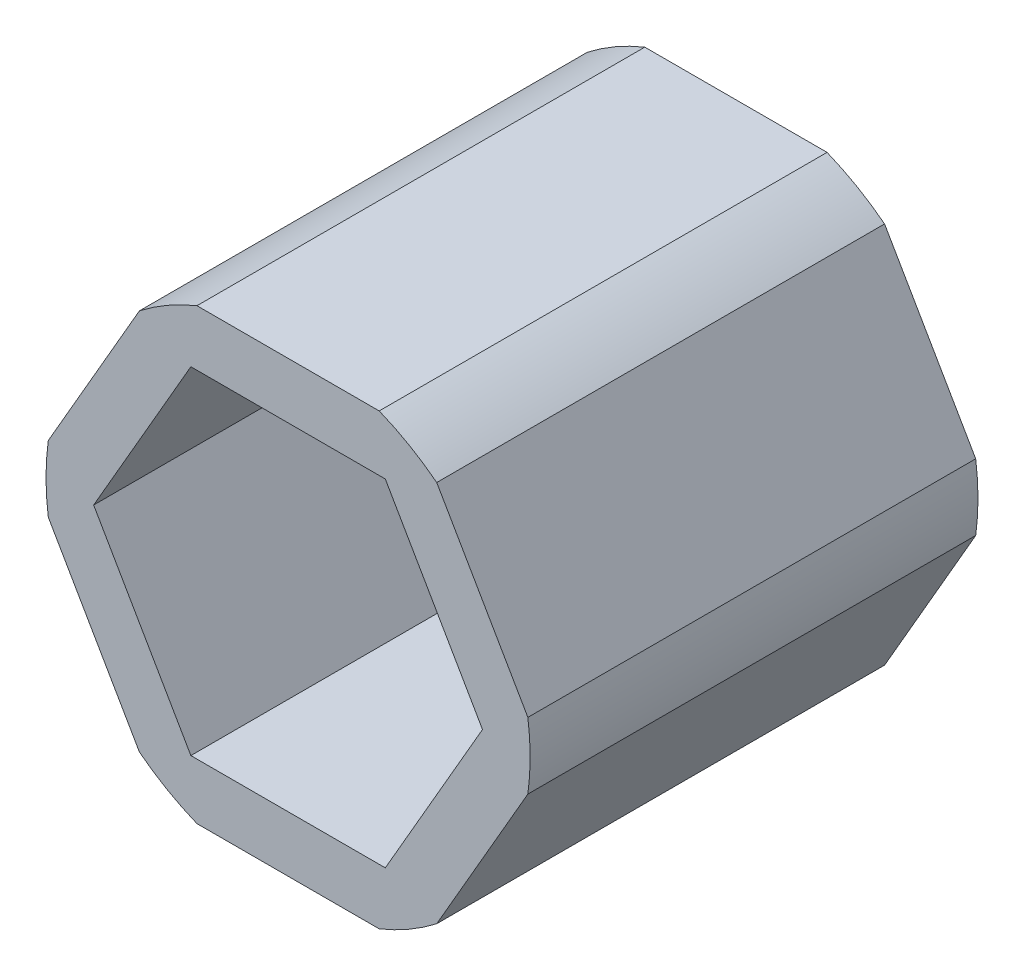
ISO-10303-21;
HEADER;
FILE_DESCRIPTION(('STEP AP214'),'2;1');
FILE_NAME('part.step','',(''),(''),'','','');
FILE_SCHEMA(('AUTOMOTIVE_DESIGN { 1 0 10303 214 1 1 1 1 }'));
ENDSEC;
DATA;
#1=APPLICATION_CONTEXT('core data for automotive mechanical design processes');
#2=APPLICATION_PROTOCOL_DEFINITION('international standard','automotive_design',2000,#1);
#3=PRODUCT_CONTEXT('',#1,'mechanical');
#4=PRODUCT('Part','Part','',(#3));
#5=PRODUCT_RELATED_PRODUCT_CATEGORY('part','',(#4));
#6=PRODUCT_DEFINITION_FORMATION('','',#4);
#7=PRODUCT_DEFINITION_CONTEXT('part definition',#1,'design');
#8=PRODUCT_DEFINITION('design','',#6,#7);
#9=PRODUCT_DEFINITION_SHAPE('','',#8);
#10=(LENGTH_UNIT() NAMED_UNIT(*) SI_UNIT(.MILLI.,.METRE.));
#11=(NAMED_UNIT(*) PLANE_ANGLE_UNIT() SI_UNIT($,.RADIAN.));
#12=(NAMED_UNIT(*) SI_UNIT($,.STERADIAN.) SOLID_ANGLE_UNIT());
#13=UNCERTAINTY_MEASURE_WITH_UNIT(LENGTH_MEASURE(1.E-05),#10,'distance_accuracy_value','');
#14=(GEOMETRIC_REPRESENTATION_CONTEXT(3) GLOBAL_UNCERTAINTY_ASSIGNED_CONTEXT((#13)) GLOBAL_UNIT_ASSIGNED_CONTEXT((#10,
#11,#12)) REPRESENTATION_CONTEXT('',''));
#15=CARTESIAN_POINT('',(0.,0.,0.));
#16=DIRECTION('',(0.,0.,1.));
#17=DIRECTION('',(1.,0.,0.));
#18=AXIS2_PLACEMENT_3D('',#15,#16,#17);
#19=CARTESIAN_POINT('',(0.,0.,-6.35));
#20=DIRECTION('',(0.,0.,1.));
#21=DIRECTION('',(1.,0.,0.));
#22=AXIS2_PLACEMENT_3D('',#19,#20,#21);
#23=CYLINDRICAL_SURFACE('',#22,6.865);
#24=CARTESIAN_POINT('',(0.,0.,6.35));
#25=DIRECTION('',(0.,0.,1.));
#26=DIRECTION('',(1.,0.,0.));
#27=AXIS2_PLACEMENT_3D('',#24,#25,#26);
#28=CIRCLE('',#27,6.865);
#29=CARTESIAN_POINT('',(6.80007335868807,0.941927447556715,6.35));
#30=VERTEX_POINT('',#29);
#31=CARTESIAN_POINT('',(6.80007335868808,-0.941927447556706,6.35));
#32=VERTEX_POINT('',#31);
#33=EDGE_CURVE('E140',#30,#32,#28,.F.);
#34=ORIENTED_EDGE('',*,*,#33,.T.);
#35=DIRECTION('',(0.,0.,1.));
#36=VECTOR('',#35,1.);
#37=CARTESIAN_POINT('',(6.80007335868808,-0.941927447556707,6.35));
#38=LINE('',#37,#36);
#39=CARTESIAN_POINT('',(6.80007335868807,-0.941927447556706,-6.35));
#40=VERTEX_POINT('',#39);
#41=EDGE_CURVE('E215',#32,#40,#38,.F.);
#42=ORIENTED_EDGE('',*,*,#41,.T.);
#43=CARTESIAN_POINT('',(0.,0.,-6.35));
#44=DIRECTION('',(0.,0.,1.));
#45=DIRECTION('',(1.,0.,0.));
#46=AXIS2_PLACEMENT_3D('',#43,#44,#45);
#47=CIRCLE('',#46,6.865);
#48=CARTESIAN_POINT('',(6.80007335868807,0.941927447556718,-6.35));
#49=VERTEX_POINT('',#48);
#50=EDGE_CURVE('E21',#40,#49,#47,.T.);
#51=ORIENTED_EDGE('',*,*,#50,.T.);
#52=DIRECTION('',(0.,0.,1.));
#53=VECTOR('',#52,1.);
#54=CARTESIAN_POINT('',(6.80007335868807,0.941927447556716,6.35));
#55=LINE('',#54,#53);
#56=EDGE_CURVE('E155',#49,#30,#55,.T.);
#57=ORIENTED_EDGE('',*,*,#56,.T.);
#58=EDGE_LOOP('',(#34,#42,#51,#57));
#59=FACE_BOUND('',#58,.T.);
#60=ADVANCED_FACE('F18',(#59),#23,.T.);
#61=CARTESIAN_POINT('',(-2.75684753538046,-4.775,6.35));
#62=DIRECTION('',(0.,1.,0.));
#63=DIRECTION('',(-1.,0.,0.));
#64=AXIS2_PLACEMENT_3D('',#61,#62,#63);
#65=PLANE('',#64);
#66=DIRECTION('',(1.,0.,0.));
#67=VECTOR('',#66,1.);
#68=CARTESIAN_POINT('',(0.,-4.775,6.35));
#69=LINE('',#68,#67);
#70=CARTESIAN_POINT('',(2.75684753538046,-4.775,6.35));
#71=VERTEX_POINT('',#70);
#72=CARTESIAN_POINT('',(-2.75684753538046,-4.775,6.35));
#73=VERTEX_POINT('',#72);
#74=EDGE_CURVE('E175',#71,#73,#69,.F.);
#75=ORIENTED_EDGE('',*,*,#74,.F.);
#76=DIRECTION('',(0.,0.,1.));
#77=VECTOR('',#76,1.);
#78=CARTESIAN_POINT('',(2.75684753538046,-4.775,6.35));
#79=LINE('',#78,#77);
#80=CARTESIAN_POINT('',(2.75684753538046,-4.775,-6.35));
#81=VERTEX_POINT('',#80);
#82=EDGE_CURVE('E181',#81,#71,#79,.T.);
#83=ORIENTED_EDGE('',*,*,#82,.F.);
#84=DIRECTION('',(1.,0.,0.));
#85=VECTOR('',#84,1.);
#86=CARTESIAN_POINT('',(0.,-4.775,-6.35));
#87=LINE('',#86,#85);
#88=CARTESIAN_POINT('',(-2.75684753538046,-4.775,-6.35));
#89=VERTEX_POINT('',#88);
#90=EDGE_CURVE('E208',#81,#89,#87,.F.);
#91=ORIENTED_EDGE('',*,*,#90,.T.);
#92=DIRECTION('',(0.,0.,1.));
#93=VECTOR('',#92,1.);
#94=CARTESIAN_POINT('',(-2.75684753538046,-4.775,6.35));
#95=LINE('',#94,#93);
#96=EDGE_CURVE('E152',#73,#89,#95,.F.);
#97=ORIENTED_EDGE('',*,*,#96,.F.);
#98=EDGE_LOOP('',(#75,#83,#91,#97));
#99=FACE_BOUND('',#98,.T.);
#100=ADVANCED_FACE('F313',(#99),#65,.T.);
#101=CARTESIAN_POINT('',(-5.51369507076093,0.,6.35));
#102=DIRECTION('',(0.866025403784439,0.5,0.));
#103=DIRECTION('',(-0.5,0.866025403784439,0.));
#104=AXIS2_PLACEMENT_3D('',#101,#102,#103);
#105=PLANE('',#104);
#106=DIRECTION('',(-0.5,0.866025403784439,0.));
#107=VECTOR('',#106,1.);
#108=CARTESIAN_POINT('',(-2.75684753538046,-4.775,6.35));
#109=LINE('',#108,#107);
#110=CARTESIAN_POINT('',(-5.51369507076093,0.,6.35));
#111=VERTEX_POINT('',#110);
#112=EDGE_CURVE('E168',#73,#111,#109,.T.);
#113=ORIENTED_EDGE('',*,*,#112,.F.);
#114=ORIENTED_EDGE('',*,*,#96,.T.);
#115=DIRECTION('',(-0.5,0.866025403784439,0.));
#116=VECTOR('',#115,1.);
#117=CARTESIAN_POINT('',(-2.75684753538046,-4.775,-6.35));
#118=LINE('',#117,#116);
#119=CARTESIAN_POINT('',(-5.51369507076093,0.,-6.35));
#120=VERTEX_POINT('',#119);
#121=EDGE_CURVE('E206',#89,#120,#118,.T.);
#122=ORIENTED_EDGE('',*,*,#121,.T.);
#123=DIRECTION('',(0.,0.,1.));
#124=VECTOR('',#123,1.);
#125=CARTESIAN_POINT('',(-5.51369507076093,0.,6.35));
#126=LINE('',#125,#124);
#127=EDGE_CURVE('E210',#111,#120,#126,.F.);
#128=ORIENTED_EDGE('',*,*,#127,.F.);
#129=EDGE_LOOP('',(#113,#114,#122,#128));
#130=FACE_BOUND('',#129,.T.);
#131=ADVANCED_FACE('F317',(#130),#105,.T.);
#132=CARTESIAN_POINT('',(7.34389542409204,0.,6.35));
#133=DIRECTION('',(-0.866025403784438,-0.5,0.));
#134=DIRECTION('',(0.5,-0.866025403784438,0.));
#135=AXIS2_PLACEMENT_3D('',#132,#133,#134);
#136=PLANE('',#135);
#137=DIRECTION('',(-0.5,0.866025403784438,0.));
#138=VECTOR('',#137,1.);
#139=CARTESIAN_POINT('',(6.80007335868807,0.941927447556716,-6.35));
#140=LINE('',#139,#138);
#141=CARTESIAN_POINT('',(4.21576977744998,5.41807255244329,-6.35));
#142=VERTEX_POINT('',#141);
#143=EDGE_CURVE('E187',#49,#142,#140,.T.);
#144=ORIENTED_EDGE('',*,*,#143,.T.);
#145=DIRECTION('',(0.,0.,1.));
#146=VECTOR('',#145,1.);
#147=CARTESIAN_POINT('',(4.21576977744998,5.41807255244329,-6.35));
#148=LINE('',#147,#146);
#149=CARTESIAN_POINT('',(4.21576977744998,5.41807255244329,6.35));
#150=VERTEX_POINT('',#149);
#151=EDGE_CURVE('E158',#150,#142,#148,.F.);
#152=ORIENTED_EDGE('',*,*,#151,.F.);
#153=DIRECTION('',(-0.5,0.866025403784438,0.));
#154=VECTOR('',#153,1.);
#155=CARTESIAN_POINT('',(6.80007335868807,0.941927447556716,6.35));
#156=LINE('',#155,#154);
#157=EDGE_CURVE('E145',#30,#150,#156,.T.);
#158=ORIENTED_EDGE('',*,*,#157,.F.);
#159=ORIENTED_EDGE('',*,*,#56,.F.);
#160=EDGE_LOOP('',(#144,#152,#158,#159));
#161=FACE_BOUND('',#160,.T.);
#162=ADVANCED_FACE('F160',(#161),#136,.F.);
#163=CARTESIAN_POINT('',(0.,0.,-6.35));
#164=DIRECTION('',(0.,0.,1.));
#165=DIRECTION('',(1.,0.,0.));
#166=AXIS2_PLACEMENT_3D('',#163,#164,#165);
#167=CYLINDRICAL_SURFACE('',#166,6.865);
#168=DIRECTION('',(0.,0.,-1.));
#169=VECTOR('',#168,1.);
#170=CARTESIAN_POINT('',(2.58430358123807,6.36000000000001,6.35));
#171=LINE('',#170,#169);
#172=CARTESIAN_POINT('',(2.58430358123807,6.36000000000001,-6.35));
#173=VERTEX_POINT('',#172);
#174=CARTESIAN_POINT('',(2.58430358123807,6.36000000000001,6.35));
#175=VERTEX_POINT('',#174);
#176=EDGE_CURVE('E235',#173,#175,#171,.F.);
#177=ORIENTED_EDGE('',*,*,#176,.T.);
#178=CARTESIAN_POINT('',(0.,0.,6.35));
#179=DIRECTION('',(0.,0.,1.));
#180=DIRECTION('',(1.,0.,0.));
#181=AXIS2_PLACEMENT_3D('',#178,#179,#180);
#182=CIRCLE('',#181,6.865);
#183=EDGE_CURVE('E163',#150,#175,#182,.T.);
#184=ORIENTED_EDGE('',*,*,#183,.F.);
#185=ORIENTED_EDGE('',*,*,#151,.T.);
#186=CARTESIAN_POINT('',(0.,0.,-6.35));
#187=DIRECTION('',(0.,0.,1.));
#188=DIRECTION('',(1.,0.,0.));
#189=AXIS2_PLACEMENT_3D('',#186,#187,#188);
#190=CIRCLE('',#189,6.865);
#191=EDGE_CURVE('E186',#142,#173,#190,.T.);
#192=ORIENTED_EDGE('',*,*,#191,.T.);
#193=EDGE_LOOP('',(#177,#184,#185,#192));
#194=FACE_BOUND('',#193,.T.);
#195=ADVANCED_FACE('F452',(#194),#167,.T.);
#196=CARTESIAN_POINT('',(3.67194771204601,6.36000000000001,6.35));
#197=DIRECTION('',(0.,-1.,0.));
#198=DIRECTION('',(0.,0.,-1.));
#199=AXIS2_PLACEMENT_3D('',#196,#197,#198);
#200=PLANE('',#199);
#201=DIRECTION('',(1.,0.,0.));
#202=VECTOR('',#201,1.);
#203=CARTESIAN_POINT('',(0.,6.36000000000001,-6.35));
#204=LINE('',#203,#202);
#205=CARTESIAN_POINT('',(-2.58430358123807,6.36000000000001,-6.35));
#206=VERTEX_POINT('',#205);
#207=EDGE_CURVE('E202',#173,#206,#204,.F.);
#208=ORIENTED_EDGE('',*,*,#207,.T.);
#209=DIRECTION('',(0.,0.,1.));
#210=VECTOR('',#209,1.);
#211=CARTESIAN_POINT('',(-2.58430358123807,6.36000000000001,-6.35));
#212=LINE('',#211,#210);
#213=CARTESIAN_POINT('',(-2.58430358123807,6.36000000000001,6.35));
#214=VERTEX_POINT('',#213);
#215=EDGE_CURVE('E232',#214,#206,#212,.F.);
#216=ORIENTED_EDGE('',*,*,#215,.F.);
#217=DIRECTION('',(1.,0.,0.));
#218=VECTOR('',#217,1.);
#219=CARTESIAN_POINT('',(0.,6.36000000000001,6.35));
#220=LINE('',#219,#218);
#221=EDGE_CURVE('E166',#175,#214,#220,.F.);
#222=ORIENTED_EDGE('',*,*,#221,.F.);
#223=ORIENTED_EDGE('',*,*,#176,.F.);
#224=EDGE_LOOP('',(#208,#216,#222,#223));
#225=FACE_BOUND('',#224,.T.);
#226=ADVANCED_FACE('F444',(#225),#200,.F.);
#227=CARTESIAN_POINT('',(0.,0.,-6.35));
#228=DIRECTION('',(0.,0.,1.));
#229=DIRECTION('',(1.,0.,0.));
#230=AXIS2_PLACEMENT_3D('',#227,#228,#229);
#231=CYLINDRICAL_SURFACE('',#230,6.865);
#232=DIRECTION('',(0.,0.,1.));
#233=VECTOR('',#232,1.);
#234=CARTESIAN_POINT('',(-4.21576977744999,5.41807255244328,6.35));
#235=LINE('',#234,#233);
#236=CARTESIAN_POINT('',(-4.21576977744999,5.41807255244328,-6.35));
#237=VERTEX_POINT('',#236);
#238=CARTESIAN_POINT('',(-4.21576977744999,5.41807255244328,6.35));
#239=VERTEX_POINT('',#238);
#240=EDGE_CURVE('E230',#237,#239,#235,.T.);
#241=ORIENTED_EDGE('',*,*,#240,.T.);
#242=CARTESIAN_POINT('',(0.,0.,6.35));
#243=DIRECTION('',(0.,0.,1.));
#244=DIRECTION('',(1.,0.,0.));
#245=AXIS2_PLACEMENT_3D('',#242,#243,#244);
#246=CIRCLE('',#245,6.865);
#247=EDGE_CURVE('E251',#214,#239,#246,.T.);
#248=ORIENTED_EDGE('',*,*,#247,.F.);
#249=ORIENTED_EDGE('',*,*,#215,.T.);
#250=CARTESIAN_POINT('',(0.,0.,-6.35));
#251=DIRECTION('',(0.,0.,1.));
#252=DIRECTION('',(1.,0.,0.));
#253=AXIS2_PLACEMENT_3D('',#250,#251,#252);
#254=CIRCLE('',#253,6.865);
#255=EDGE_CURVE('E201',#206,#237,#254,.T.);
#256=ORIENTED_EDGE('',*,*,#255,.T.);
#257=EDGE_LOOP('',(#241,#248,#249,#256));
#258=FACE_BOUND('',#257,.T.);
#259=ADVANCED_FACE('F262',(#258),#231,.T.);
#260=CARTESIAN_POINT('',(-3.67194771204602,6.36000000000001,6.35));
#261=DIRECTION('',(0.866025403784439,-0.5,0.));
#262=DIRECTION('',(0.5,0.866025403784439,0.));
#263=AXIS2_PLACEMENT_3D('',#260,#261,#262);
#264=PLANE('',#263);
#265=DIRECTION('',(-0.5,-0.866025403784439,0.));
#266=VECTOR('',#265,1.);
#267=CARTESIAN_POINT('',(-4.21576977744999,5.41807255244328,-6.35));
#268=LINE('',#267,#266);
#269=CARTESIAN_POINT('',(-6.80007335868807,0.941927447556718,-6.35));
#270=VERTEX_POINT('',#269);
#271=EDGE_CURVE('E199',#237,#270,#268,.T.);
#272=ORIENTED_EDGE('',*,*,#271,.T.);
#273=DIRECTION('',(0.,0.,1.));
#274=VECTOR('',#273,1.);
#275=CARTESIAN_POINT('',(-6.80007335868807,0.941927447556718,-6.35));
#276=LINE('',#275,#274);
#277=CARTESIAN_POINT('',(-6.80007335868807,0.941927447556718,6.35));
#278=VERTEX_POINT('',#277);
#279=EDGE_CURVE('E227',#278,#270,#276,.F.);
#280=ORIENTED_EDGE('',*,*,#279,.F.);
#281=DIRECTION('',(-0.5,-0.866025403784439,0.));
#282=VECTOR('',#281,1.);
#283=CARTESIAN_POINT('',(-4.21576977744999,5.41807255244328,6.35));
#284=LINE('',#283,#282);
#285=EDGE_CURVE('E250',#239,#278,#284,.T.);
#286=ORIENTED_EDGE('',*,*,#285,.F.);
#287=ORIENTED_EDGE('',*,*,#240,.F.);
#288=EDGE_LOOP('',(#272,#280,#286,#287));
#289=FACE_BOUND('',#288,.T.);
#290=ADVANCED_FACE('F269',(#289),#264,.F.);
#291=CARTESIAN_POINT('',(0.,0.,-6.35));
#292=DIRECTION('',(0.,0.,1.));
#293=DIRECTION('',(1.,0.,0.));
#294=AXIS2_PLACEMENT_3D('',#291,#292,#293);
#295=CYLINDRICAL_SURFACE('',#294,6.865);
#296=DIRECTION('',(0.,0.,1.));
#297=VECTOR('',#296,1.);
#298=CARTESIAN_POINT('',(-6.80007335868807,-0.941927447556732,6.35));
#299=LINE('',#298,#297);
#300=CARTESIAN_POINT('',(-6.80007335868807,-0.941927447556732,-6.35));
#301=VERTEX_POINT('',#300);
#302=CARTESIAN_POINT('',(-6.80007335868807,-0.941927447556731,6.35));
#303=VERTEX_POINT('',#302);
#304=EDGE_CURVE('E225',#301,#303,#299,.T.);
#305=ORIENTED_EDGE('',*,*,#304,.T.);
#306=CARTESIAN_POINT('',(0.,0.,6.35));
#307=DIRECTION('',(0.,0.,1.));
#308=DIRECTION('',(1.,0.,0.));
#309=AXIS2_PLACEMENT_3D('',#306,#307,#308);
#310=CIRCLE('',#309,6.865);
#311=EDGE_CURVE('E247',#278,#303,#310,.T.);
#312=ORIENTED_EDGE('',*,*,#311,.F.);
#313=ORIENTED_EDGE('',*,*,#279,.T.);
#314=CARTESIAN_POINT('',(0.,0.,-6.35));
#315=DIRECTION('',(0.,0.,1.));
#316=DIRECTION('',(1.,0.,0.));
#317=AXIS2_PLACEMENT_3D('',#314,#315,#316);
#318=CIRCLE('',#317,6.865);
#319=EDGE_CURVE('E198',#270,#301,#318,.T.);
#320=ORIENTED_EDGE('',*,*,#319,.T.);
#321=EDGE_LOOP('',(#305,#312,#313,#320));
#322=FACE_BOUND('',#321,.T.);
#323=ADVANCED_FACE('F278',(#322),#295,.T.);
#324=CARTESIAN_POINT('',(-7.34389542409204,0.,6.35));
#325=DIRECTION('',(0.866025403784438,0.5,0.));
#326=DIRECTION('',(-0.5,0.866025403784438,0.));
#327=AXIS2_PLACEMENT_3D('',#324,#325,#326);
#328=PLANE('',#327);
#329=DIRECTION('',(0.5,-0.866025403784439,0.));
#330=VECTOR('',#329,1.);
#331=CARTESIAN_POINT('',(-6.80007335868807,-0.941927447556733,-6.35));
#332=LINE('',#331,#330);
#333=CARTESIAN_POINT('',(-4.21576977745,-5.41807255244328,-6.35));
#334=VERTEX_POINT('',#333);
#335=EDGE_CURVE('E196',#301,#334,#332,.T.);
#336=ORIENTED_EDGE('',*,*,#335,.T.);
#337=DIRECTION('',(0.,0.,1.));
#338=VECTOR('',#337,1.);
#339=CARTESIAN_POINT('',(-4.21576977745,-5.41807255244328,-6.35));
#340=LINE('',#339,#338);
#341=CARTESIAN_POINT('',(-4.21576977745,-5.41807255244328,6.35));
#342=VERTEX_POINT('',#341);
#343=EDGE_CURVE('E222',#342,#334,#340,.F.);
#344=ORIENTED_EDGE('',*,*,#343,.F.);
#345=DIRECTION('',(0.5,-0.866025403784438,0.));
#346=VECTOR('',#345,1.);
#347=CARTESIAN_POINT('',(-6.80007335868807,-0.941927447556733,6.35));
#348=LINE('',#347,#346);
#349=EDGE_CURVE('E246',#303,#342,#348,.T.);
#350=ORIENTED_EDGE('',*,*,#349,.F.);
#351=ORIENTED_EDGE('',*,*,#304,.F.);
#352=EDGE_LOOP('',(#336,#344,#350,#351));
#353=FACE_BOUND('',#352,.T.);
#354=ADVANCED_FACE('F282',(#353),#328,.F.);
#355=CARTESIAN_POINT('',(0.,0.,-6.35));
#356=DIRECTION('',(0.,0.,1.));
#357=DIRECTION('',(1.,0.,0.));
#358=AXIS2_PLACEMENT_3D('',#355,#356,#357);
#359=CYLINDRICAL_SURFACE('',#358,6.865);
#360=DIRECTION('',(0.,0.,1.));
#361=VECTOR('',#360,1.);
#362=CARTESIAN_POINT('',(-2.58430358123808,-6.36,6.35));
#363=LINE('',#362,#361);
#364=CARTESIAN_POINT('',(-2.58430358123808,-6.36,-6.35));
#365=VERTEX_POINT('',#364);
#366=CARTESIAN_POINT('',(-2.58430358123808,-6.36,6.35));
#367=VERTEX_POINT('',#366);
#368=EDGE_CURVE('E220',#365,#367,#363,.T.);
#369=ORIENTED_EDGE('',*,*,#368,.T.);
#370=CARTESIAN_POINT('',(0.,0.,6.35));
#371=DIRECTION('',(0.,0.,1.));
#372=DIRECTION('',(1.,0.,0.));
#373=AXIS2_PLACEMENT_3D('',#370,#371,#372);
#374=CIRCLE('',#373,6.865);
#375=EDGE_CURVE('E243',#342,#367,#374,.T.);
#376=ORIENTED_EDGE('',*,*,#375,.F.);
#377=ORIENTED_EDGE('',*,*,#343,.T.);
#378=CARTESIAN_POINT('',(0.,0.,-6.35));
#379=DIRECTION('',(0.,0.,1.));
#380=DIRECTION('',(1.,0.,0.));
#381=AXIS2_PLACEMENT_3D('',#378,#379,#380);
#382=CIRCLE('',#381,6.865);
#383=EDGE_CURVE('E195',#334,#365,#382,.T.);
#384=ORIENTED_EDGE('',*,*,#383,.T.);
#385=EDGE_LOOP('',(#369,#376,#377,#384));
#386=FACE_BOUND('',#385,.T.);
#387=ADVANCED_FACE('F406',(#386),#359,.T.);
#388=CARTESIAN_POINT('',(-3.67194771204602,-6.36,6.35));
#389=DIRECTION('',(0.,1.,0.));
#390=DIRECTION('',(-1.,0.,0.));
#391=AXIS2_PLACEMENT_3D('',#388,#389,#390);
#392=PLANE('',#391);
#393=DIRECTION('',(1.,0.,0.));
#394=VECTOR('',#393,1.);
#395=CARTESIAN_POINT('',(0.,-6.36,-6.35));
#396=LINE('',#395,#394);
#397=CARTESIAN_POINT('',(2.58430358123807,-6.36000000000001,-6.35));
#398=VERTEX_POINT('',#397);
#399=EDGE_CURVE('E193',#365,#398,#396,.T.);
#400=ORIENTED_EDGE('',*,*,#399,.T.);
#401=DIRECTION('',(0.,0.,1.));
#402=VECTOR('',#401,1.);
#403=CARTESIAN_POINT('',(2.58430358123807,-6.36000000000001,-6.35));
#404=LINE('',#403,#402);
#405=CARTESIAN_POINT('',(2.58430358123807,-6.36000000000001,6.35));
#406=VERTEX_POINT('',#405);
#407=EDGE_CURVE('E217',#406,#398,#404,.F.);
#408=ORIENTED_EDGE('',*,*,#407,.F.);
#409=DIRECTION('',(1.,0.,0.));
#410=VECTOR('',#409,1.);
#411=CARTESIAN_POINT('',(0.,-6.36,6.35));
#412=LINE('',#411,#410);
#413=EDGE_CURVE('E242',#367,#406,#412,.T.);
#414=ORIENTED_EDGE('',*,*,#413,.F.);
#415=ORIENTED_EDGE('',*,*,#368,.F.);
#416=EDGE_LOOP('',(#400,#408,#414,#415));
#417=FACE_BOUND('',#416,.T.);
#418=ADVANCED_FACE('F397',(#417),#392,.F.);
#419=CARTESIAN_POINT('',(0.,0.,-6.35));
#420=DIRECTION('',(0.,0.,1.));
#421=DIRECTION('',(1.,0.,0.));
#422=AXIS2_PLACEMENT_3D('',#419,#420,#421);
#423=CYLINDRICAL_SURFACE('',#422,6.865);
#424=ORIENTED_EDGE('',*,*,#407,.T.);
#425=CARTESIAN_POINT('',(0.,0.,-6.35));
#426=DIRECTION('',(0.,0.,1.));
#427=DIRECTION('',(1.,0.,0.));
#428=AXIS2_PLACEMENT_3D('',#425,#426,#427);
#429=CIRCLE('',#428,6.865);
#430=CARTESIAN_POINT('',(4.21576977744998,-5.41807255244329,-6.35));
#431=VERTEX_POINT('',#430);
#432=EDGE_CURVE('E192',#398,#431,#429,.T.);
#433=ORIENTED_EDGE('',*,*,#432,.T.);
#434=DIRECTION('',(0.,0.,1.));
#435=VECTOR('',#434,1.);
#436=CARTESIAN_POINT('',(4.21576977744998,-5.41807255244329,6.35));
#437=LINE('',#436,#435);
#438=CARTESIAN_POINT('',(4.21576977744998,-5.41807255244329,6.35));
#439=VERTEX_POINT('',#438);
#440=EDGE_CURVE('E213',#431,#439,#437,.T.);
#441=ORIENTED_EDGE('',*,*,#440,.T.);
#442=CARTESIAN_POINT('',(0.,0.,6.35));
#443=DIRECTION('',(0.,0.,1.));
#444=DIRECTION('',(1.,0.,0.));
#445=AXIS2_PLACEMENT_3D('',#442,#443,#444);
#446=CIRCLE('',#445,6.865);
#447=EDGE_CURVE('E240',#406,#439,#446,.T.);
#448=ORIENTED_EDGE('',*,*,#447,.F.);
#449=EDGE_LOOP('',(#424,#433,#441,#448));
#450=FACE_BOUND('',#449,.T.);
#451=ADVANCED_FACE('F388',(#450),#423,.T.);
#452=CARTESIAN_POINT('',(3.67194771204602,-6.36000000000001,6.35));
#453=DIRECTION('',(-0.866025403784439,0.5,0.));
#454=DIRECTION('',(-0.5,-0.866025403784439,0.));
#455=AXIS2_PLACEMENT_3D('',#452,#453,#454);
#456=PLANE('',#455);
#457=DIRECTION('',(0.5,0.866025403784439,0.));
#458=VECTOR('',#457,1.);
#459=CARTESIAN_POINT('',(4.21576977744998,-5.41807255244329,-6.35));
#460=LINE('',#459,#458);
#461=EDGE_CURVE('E189',#431,#40,#460,.T.);
#462=ORIENTED_EDGE('',*,*,#461,.T.);
#463=ORIENTED_EDGE('',*,*,#41,.F.);
#464=DIRECTION('',(0.5,0.866025403784439,0.));
#465=VECTOR('',#464,1.);
#466=CARTESIAN_POINT('',(4.21576977744998,-5.41807255244329,6.35));
#467=LINE('',#466,#465);
#468=EDGE_CURVE('E148',#439,#32,#467,.T.);
#469=ORIENTED_EDGE('',*,*,#468,.F.);
#470=ORIENTED_EDGE('',*,*,#440,.F.);
#471=EDGE_LOOP('',(#462,#463,#469,#470));
#472=FACE_BOUND('',#471,.T.);
#473=ADVANCED_FACE('F334',(#472),#456,.F.);
#474=CARTESIAN_POINT('',(-2.75684753538046,4.775,6.35));
#475=DIRECTION('',(0.866025403784439,-0.5,0.));
#476=DIRECTION('',(0.5,0.866025403784439,0.));
#477=AXIS2_PLACEMENT_3D('',#474,#475,#476);
#478=PLANE('',#477);
#479=DIRECTION('',(0.5,0.866025403784439,0.));
#480=VECTOR('',#479,1.);
#481=CARTESIAN_POINT('',(-5.51369507076093,0.,6.35));
#482=LINE('',#481,#480);
#483=CARTESIAN_POINT('',(-2.75684753538046,4.775,6.35));
#484=VERTEX_POINT('',#483);
#485=EDGE_CURVE('E164',#111,#484,#482,.T.);
#486=ORIENTED_EDGE('',*,*,#485,.F.);
#487=ORIENTED_EDGE('',*,*,#127,.T.);
#488=DIRECTION('',(0.5,0.866025403784439,0.));
#489=VECTOR('',#488,1.);
#490=CARTESIAN_POINT('',(-5.51369507076093,0.,-6.35));
#491=LINE('',#490,#489);
#492=CARTESIAN_POINT('',(-2.75684753538046,4.775,-6.35));
#493=VERTEX_POINT('',#492);
#494=EDGE_CURVE('E204',#120,#493,#491,.T.);
#495=ORIENTED_EDGE('',*,*,#494,.T.);
#496=DIRECTION('',(0.,0.,-1.));
#497=VECTOR('',#496,1.);
#498=CARTESIAN_POINT('',(-2.75684753538046,4.775,6.35));
#499=LINE('',#498,#497);
#500=EDGE_CURVE('E295',#484,#493,#499,.T.);
#501=ORIENTED_EDGE('',*,*,#500,.F.);
#502=EDGE_LOOP('',(#486,#487,#495,#501));
#503=FACE_BOUND('',#502,.T.);
#504=ADVANCED_FACE('F321',(#503),#478,.T.);
#505=CARTESIAN_POINT('',(0.,0.,-6.35));
#506=DIRECTION('',(0.,0.,1.));
#507=DIRECTION('',(1.,0.,0.));
#508=AXIS2_PLACEMENT_3D('',#505,#506,#507);
#509=PLANE('',#508);
#510=ORIENTED_EDGE('',*,*,#143,.F.);
#511=ORIENTED_EDGE('',*,*,#50,.F.);
#512=ORIENTED_EDGE('',*,*,#461,.F.);
#513=ORIENTED_EDGE('',*,*,#432,.F.);
#514=ORIENTED_EDGE('',*,*,#399,.F.);
#515=ORIENTED_EDGE('',*,*,#383,.F.);
#516=ORIENTED_EDGE('',*,*,#335,.F.);
#517=ORIENTED_EDGE('',*,*,#319,.F.);
#518=ORIENTED_EDGE('',*,*,#271,.F.);
#519=ORIENTED_EDGE('',*,*,#255,.F.);
#520=ORIENTED_EDGE('',*,*,#207,.F.);
#521=ORIENTED_EDGE('',*,*,#191,.F.);
#522=EDGE_LOOP('',(#510,#511,#512,#513,#514,#515,#516,#517,#518,#519,#520,#521));
#523=FACE_BOUND('',#522,.T.);
#524=DIRECTION('',(0.5,-0.866025403784439,0.));
#525=VECTOR('',#524,1.);
#526=CARTESIAN_POINT('',(5.51369507076093,0.,-6.35000000000001));
#527=LINE('',#526,#525);
#528=CARTESIAN_POINT('',(2.75684753538046,4.775,-6.35));
#529=VERTEX_POINT('',#528);
#530=CARTESIAN_POINT('',(5.51369507076093,0.,-6.35));
#531=VERTEX_POINT('',#530);
#532=EDGE_CURVE('E298',#529,#531,#527,.T.);
#533=ORIENTED_EDGE('',*,*,#532,.F.);
#534=DIRECTION('',(1.,0.,0.));
#535=VECTOR('',#534,1.);
#536=CARTESIAN_POINT('',(2.75684753538046,4.775,-6.35));
#537=LINE('',#536,#535);
#538=EDGE_CURVE('E291',#493,#529,#537,.T.);
#539=ORIENTED_EDGE('',*,*,#538,.F.);
#540=ORIENTED_EDGE('',*,*,#494,.F.);
#541=ORIENTED_EDGE('',*,*,#121,.F.);
#542=ORIENTED_EDGE('',*,*,#90,.F.);
#543=DIRECTION('',(-0.5,-0.866025403784439,0.));
#544=VECTOR('',#543,1.);
#545=CARTESIAN_POINT('',(2.75684753538046,-4.775,-6.35));
#546=LINE('',#545,#544);
#547=EDGE_CURVE('E183',#531,#81,#546,.T.);
#548=ORIENTED_EDGE('',*,*,#547,.F.);
#549=EDGE_LOOP('',(#533,#539,#540,#541,#542,#548));
#550=FACE_BOUND('',#549,.T.);
#551=ADVANCED_FACE('F272',(#523,#550),#509,.F.);
#552=CARTESIAN_POINT('',(2.75684753538046,-4.775,6.35));
#553=DIRECTION('',(-0.866025403784439,0.5,0.));
#554=DIRECTION('',(-0.5,-0.866025403784439,0.));
#555=AXIS2_PLACEMENT_3D('',#552,#553,#554);
#556=PLANE('',#555);
#557=DIRECTION('',(-0.5,-0.866025403784439,0.));
#558=VECTOR('',#557,1.);
#559=CARTESIAN_POINT('',(5.51369507076093,0.,6.35));
#560=LINE('',#559,#558);
#561=CARTESIAN_POINT('',(5.51369507076093,0.,6.35));
#562=VERTEX_POINT('',#561);
#563=EDGE_CURVE('E178',#562,#71,#560,.T.);
#564=ORIENTED_EDGE('',*,*,#563,.F.);
#565=DIRECTION('',(0.,0.,1.));
#566=VECTOR('',#565,1.);
#567=CARTESIAN_POINT('',(5.51369507076093,0.,6.35));
#568=LINE('',#567,#566);
#569=EDGE_CURVE('E301',#531,#562,#568,.T.);
#570=ORIENTED_EDGE('',*,*,#569,.F.);
#571=ORIENTED_EDGE('',*,*,#547,.T.);
#572=ORIENTED_EDGE('',*,*,#82,.T.);
#573=EDGE_LOOP('',(#564,#570,#571,#572));
#574=FACE_BOUND('',#573,.T.);
#575=ADVANCED_FACE('F310',(#574),#556,.T.);
#576=CARTESIAN_POINT('',(0.,0.,6.35));
#577=DIRECTION('',(0.,0.,1.));
#578=DIRECTION('',(1.,0.,0.));
#579=AXIS2_PLACEMENT_3D('',#576,#577,#578);
#580=PLANE('',#579);
#581=ORIENTED_EDGE('',*,*,#33,.F.);
#582=ORIENTED_EDGE('',*,*,#157,.T.);
#583=ORIENTED_EDGE('',*,*,#183,.T.);
#584=ORIENTED_EDGE('',*,*,#221,.T.);
#585=ORIENTED_EDGE('',*,*,#247,.T.);
#586=ORIENTED_EDGE('',*,*,#285,.T.);
#587=ORIENTED_EDGE('',*,*,#311,.T.);
#588=ORIENTED_EDGE('',*,*,#349,.T.);
#589=ORIENTED_EDGE('',*,*,#375,.T.);
#590=ORIENTED_EDGE('',*,*,#413,.T.);
#591=ORIENTED_EDGE('',*,*,#447,.T.);
#592=ORIENTED_EDGE('',*,*,#468,.T.);
#593=EDGE_LOOP('',(#581,#582,#583,#584,#585,#586,#587,#588,#589,#590,#591,#592));
#594=FACE_BOUND('',#593,.T.);
#595=ORIENTED_EDGE('',*,*,#485,.T.);
#596=DIRECTION('',(1.,0.,0.));
#597=VECTOR('',#596,1.);
#598=CARTESIAN_POINT('',(2.75684753538046,4.775,6.35));
#599=LINE('',#598,#597);
#600=CARTESIAN_POINT('',(2.75684753538046,4.775,6.35));
#601=VERTEX_POINT('',#600);
#602=EDGE_CURVE('E36',#601,#484,#599,.F.);
#603=ORIENTED_EDGE('',*,*,#602,.F.);
#604=DIRECTION('',(0.5,-0.866025403784439,0.));
#605=VECTOR('',#604,1.);
#606=CARTESIAN_POINT('',(5.51369507076093,0.,6.35));
#607=LINE('',#606,#605);
#608=EDGE_CURVE('E27',#562,#601,#607,.F.);
#609=ORIENTED_EDGE('',*,*,#608,.F.);
#610=ORIENTED_EDGE('',*,*,#563,.T.);
#611=ORIENTED_EDGE('',*,*,#74,.T.);
#612=ORIENTED_EDGE('',*,*,#112,.T.);
#613=EDGE_LOOP('',(#595,#603,#609,#610,#611,#612));
#614=FACE_BOUND('',#613,.T.);
#615=ADVANCED_FACE('F142',(#594,#614),#580,.T.);
#616=CARTESIAN_POINT('',(2.75684753538046,4.775,6.35));
#617=DIRECTION('',(0.,-1.,0.));
#618=DIRECTION('',(0.,0.,-1.));
#619=AXIS2_PLACEMENT_3D('',#616,#617,#618);
#620=PLANE('',#619);
#621=ORIENTED_EDGE('',*,*,#602,.T.);
#622=ORIENTED_EDGE('',*,*,#500,.T.);
#623=ORIENTED_EDGE('',*,*,#538,.T.);
#624=DIRECTION('',(0.,0.,1.));
#625=VECTOR('',#624,1.);
#626=CARTESIAN_POINT('',(2.75684753538046,4.775,6.35));
#627=LINE('',#626,#625);
#628=EDGE_CURVE('E11',#601,#529,#627,.F.);
#629=ORIENTED_EDGE('',*,*,#628,.F.);
#630=EDGE_LOOP('',(#621,#622,#623,#629));
#631=FACE_BOUND('',#630,.T.);
#632=ADVANCED_FACE('F325',(#631),#620,.T.);
#633=CARTESIAN_POINT('',(5.51369507076093,0.,6.35));
#634=DIRECTION('',(-0.866025403784439,-0.5,0.));
#635=DIRECTION('',(0.5,-0.866025403784439,0.));
#636=AXIS2_PLACEMENT_3D('',#633,#634,#635);
#637=PLANE('',#636);
#638=ORIENTED_EDGE('',*,*,#608,.T.);
#639=ORIENTED_EDGE('',*,*,#628,.T.);
#640=ORIENTED_EDGE('',*,*,#532,.T.);
#641=ORIENTED_EDGE('',*,*,#569,.T.);
#642=EDGE_LOOP('',(#638,#639,#640,#641));
#643=FACE_BOUND('',#642,.T.);
#644=ADVANCED_FACE('F306',(#643),#637,.T.);
#645=CLOSED_SHELL('',(#60,#100,#131,#162,#195,#226,#259,#290,#323,#354,#387,#418,#451,#473,#504,
#551,#575,#615,#632,#644));
#646=MANIFOLD_SOLID_BREP('B1',#645);
#647=ADVANCED_BREP_SHAPE_REPRESENTATION('',(#18,#646),#14);
#648=SHAPE_DEFINITION_REPRESENTATION(#9,#647);
ENDSEC;
END-ISO-10303-21;
